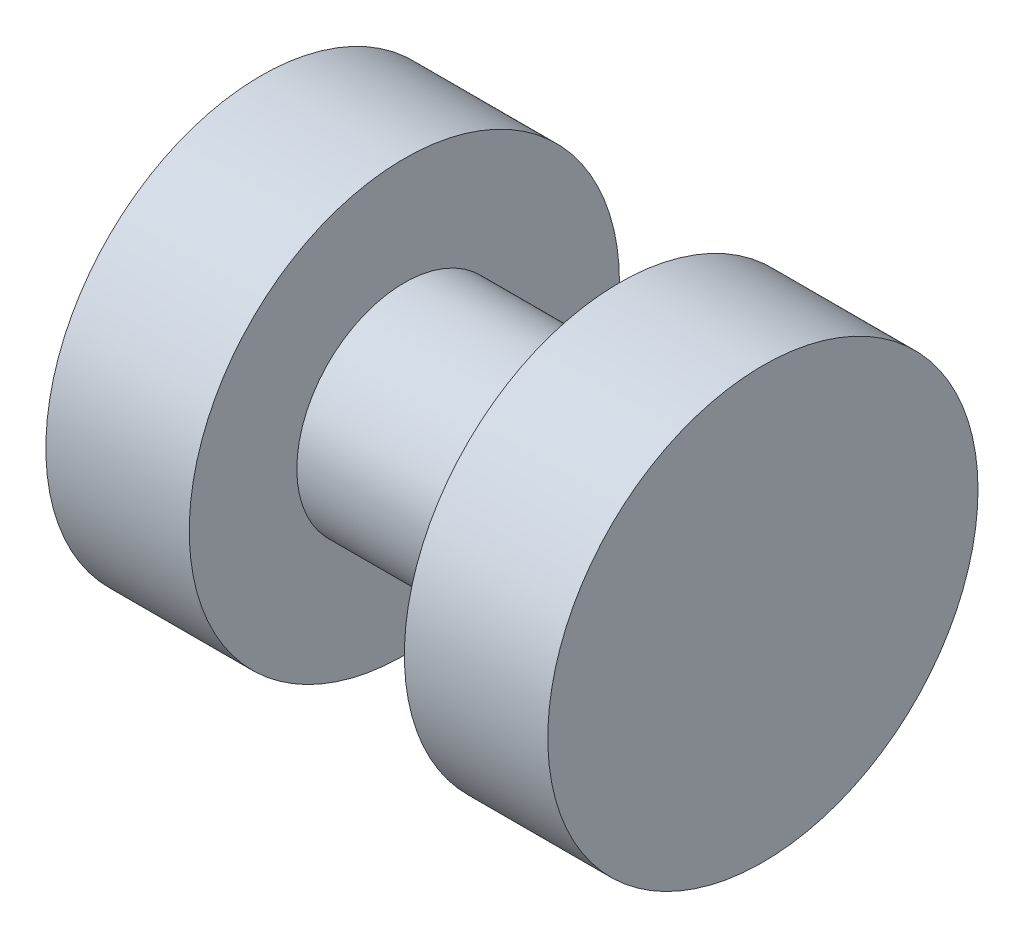
ISO-10303-21;
HEADER;
FILE_DESCRIPTION(('STEP AP214'),'2;1');
FILE_NAME('part.step','',(''),(''),'','','');
FILE_SCHEMA(('AUTOMOTIVE_DESIGN { 1 0 10303 214 1 1 1 1 }'));
ENDSEC;
DATA;
#1=APPLICATION_CONTEXT('core data for automotive mechanical design processes');
#2=APPLICATION_PROTOCOL_DEFINITION('international standard','automotive_design',2000,#1);
#3=PRODUCT_CONTEXT('',#1,'mechanical');
#4=PRODUCT('Part','Part','',(#3));
#5=PRODUCT_RELATED_PRODUCT_CATEGORY('part','',(#4));
#6=PRODUCT_DEFINITION_FORMATION('','',#4);
#7=PRODUCT_DEFINITION_CONTEXT('part definition',#1,'design');
#8=PRODUCT_DEFINITION('design','',#6,#7);
#9=PRODUCT_DEFINITION_SHAPE('','',#8);
#10=(LENGTH_UNIT() NAMED_UNIT(*) SI_UNIT(.MILLI.,.METRE.));
#11=(NAMED_UNIT(*) PLANE_ANGLE_UNIT() SI_UNIT($,.RADIAN.));
#12=(NAMED_UNIT(*) SI_UNIT($,.STERADIAN.) SOLID_ANGLE_UNIT());
#13=UNCERTAINTY_MEASURE_WITH_UNIT(LENGTH_MEASURE(1.E-05),#10,'distance_accuracy_value','');
#14=(GEOMETRIC_REPRESENTATION_CONTEXT(3) GLOBAL_UNCERTAINTY_ASSIGNED_CONTEXT((#13)) GLOBAL_UNIT_ASSIGNED_CONTEXT((#10,
#11,#12)) REPRESENTATION_CONTEXT('',''));
#15=CARTESIAN_POINT('',(0.,0.,0.));
#16=DIRECTION('',(0.,0.,1.));
#17=DIRECTION('',(1.,0.,0.));
#18=AXIS2_PLACEMENT_3D('',#15,#16,#17);
#19=CARTESIAN_POINT('',(2.,0.,0.));
#20=DIRECTION('',(-1.,0.,0.));
#21=DIRECTION('',(0.,0.,1.));
#22=AXIS2_PLACEMENT_3D('',#19,#20,#21);
#23=CYLINDRICAL_SURFACE('',#22,3.);
#24=CARTESIAN_POINT('',(2.,0.,0.));
#25=DIRECTION('',(1.,0.,0.));
#26=DIRECTION('',(0.,0.,-1.));
#27=AXIS2_PLACEMENT_3D('',#24,#25,#26);
#28=CIRCLE('',#27,3.);
#29=CARTESIAN_POINT('',(2.,0.,-3.));
#30=VERTEX_POINT('',#29);
#31=EDGE_CURVE('E37',#30,#30,#28,.T.);
#32=ORIENTED_EDGE('',*,*,#31,.F.);
#33=EDGE_LOOP('',(#32));
#34=FACE_BOUND('',#33,.T.);
#35=CARTESIAN_POINT('',(0.,0.,0.));
#36=DIRECTION('',(1.,0.,0.));
#37=DIRECTION('',(0.,0.,-1.));
#38=AXIS2_PLACEMENT_3D('',#35,#36,#37);
#39=CIRCLE('',#38,3.);
#40=CARTESIAN_POINT('',(0.,0.,-3.));
#41=VERTEX_POINT('',#40);
#42=EDGE_CURVE('E33',#41,#41,#39,.T.);
#43=ORIENTED_EDGE('',*,*,#42,.T.);
#44=EDGE_LOOP('',(#43));
#45=FACE_BOUND('',#44,.T.);
#46=ADVANCED_FACE('F30',(#34,#45),#23,.T.);
#47=CARTESIAN_POINT('',(2.,0.,0.));
#48=DIRECTION('',(1.,0.,0.));
#49=DIRECTION('',(0.,0.,-1.));
#50=AXIS2_PLACEMENT_3D('',#47,#48,#49);
#51=PLANE('',#50);
#52=CARTESIAN_POINT('',(2.,0.,0.));
#53=DIRECTION('',(1.,0.,0.));
#54=DIRECTION('',(0.,0.,-1.));
#55=AXIS2_PLACEMENT_3D('',#52,#53,#54);
#56=CIRCLE('',#55,1.5);
#57=CARTESIAN_POINT('',(2.,0.,-1.5));
#58=VERTEX_POINT('',#57);
#59=EDGE_CURVE('E10',#58,#58,#56,.T.);
#60=ORIENTED_EDGE('',*,*,#59,.F.);
#61=EDGE_LOOP('',(#60));
#62=FACE_BOUND('',#61,.T.);
#63=ORIENTED_EDGE('',*,*,#31,.T.);
#64=EDGE_LOOP('',(#63));
#65=FACE_BOUND('',#64,.T.);
#66=ADVANCED_FACE('F71',(#62,#65),#51,.T.);
#67=CARTESIAN_POINT('',(0.,0.,0.));
#68=DIRECTION('',(1.,0.,0.));
#69=DIRECTION('',(0.,0.,-1.));
#70=AXIS2_PLACEMENT_3D('',#67,#68,#69);
#71=PLANE('',#70);
#72=ORIENTED_EDGE('',*,*,#42,.F.);
#73=EDGE_LOOP('',(#72));
#74=FACE_BOUND('',#73,.T.);
#75=ADVANCED_FACE('F76',(#74),#71,.F.);
#76=CARTESIAN_POINT('',(5.,0.,0.));
#77=DIRECTION('',(-1.,0.,0.));
#78=DIRECTION('',(0.,0.,1.));
#79=AXIS2_PLACEMENT_3D('',#76,#77,#78);
#80=CYLINDRICAL_SURFACE('',#79,1.5);
#81=CARTESIAN_POINT('',(5.,0.,0.));
#82=DIRECTION('',(1.,0.,0.));
#83=DIRECTION('',(0.,0.,-1.));
#84=AXIS2_PLACEMENT_3D('',#81,#82,#83);
#85=CIRCLE('',#84,1.5);
#86=CARTESIAN_POINT('',(5.,0.,-1.5));
#87=VERTEX_POINT('',#86);
#88=EDGE_CURVE('E43',#87,#87,#85,.T.);
#89=ORIENTED_EDGE('',*,*,#88,.F.);
#90=EDGE_LOOP('',(#89));
#91=FACE_BOUND('',#90,.T.);
#92=ORIENTED_EDGE('',*,*,#59,.T.);
#93=EDGE_LOOP('',(#92));
#94=FACE_BOUND('',#93,.T.);
#95=ADVANCED_FACE('F58',(#91,#94),#80,.T.);
#96=CARTESIAN_POINT('',(7.,0.,0.));
#97=DIRECTION('',(-1.,0.,0.));
#98=DIRECTION('',(0.,0.,1.));
#99=AXIS2_PLACEMENT_3D('',#96,#97,#98);
#100=CYLINDRICAL_SURFACE('',#99,3.);
#101=CARTESIAN_POINT('',(7.,0.,0.));
#102=DIRECTION('',(1.,0.,0.));
#103=DIRECTION('',(0.,0.,-1.));
#104=AXIS2_PLACEMENT_3D('',#101,#102,#103);
#105=CIRCLE('',#104,3.);
#106=CARTESIAN_POINT('',(7.,0.,-3.));
#107=VERTEX_POINT('',#106);
#108=EDGE_CURVE('E46',#107,#107,#105,.T.);
#109=ORIENTED_EDGE('',*,*,#108,.F.);
#110=EDGE_LOOP('',(#109));
#111=FACE_BOUND('',#110,.T.);
#112=CARTESIAN_POINT('',(5.,0.,0.));
#113=DIRECTION('',(1.,0.,0.));
#114=DIRECTION('',(0.,0.,-1.));
#115=AXIS2_PLACEMENT_3D('',#112,#113,#114);
#116=CIRCLE('',#115,3.);
#117=CARTESIAN_POINT('',(5.,0.,-3.));
#118=VERTEX_POINT('',#117);
#119=EDGE_CURVE('E47',#118,#118,#116,.T.);
#120=ORIENTED_EDGE('',*,*,#119,.T.);
#121=EDGE_LOOP('',(#120));
#122=FACE_BOUND('',#121,.T.);
#123=ADVANCED_FACE('F55',(#111,#122),#100,.T.);
#124=CARTESIAN_POINT('',(7.,0.,0.));
#125=DIRECTION('',(1.,0.,0.));
#126=DIRECTION('',(0.,0.,-1.));
#127=AXIS2_PLACEMENT_3D('',#124,#125,#126);
#128=PLANE('',#127);
#129=ORIENTED_EDGE('',*,*,#108,.T.);
#130=EDGE_LOOP('',(#129));
#131=FACE_BOUND('',#130,.T.);
#132=ADVANCED_FACE('F53',(#131),#128,.T.);
#133=CARTESIAN_POINT('',(5.,0.,0.));
#134=DIRECTION('',(1.,0.,0.));
#135=DIRECTION('',(0.,0.,-1.));
#136=AXIS2_PLACEMENT_3D('',#133,#134,#135);
#137=PLANE('',#136);
#138=ORIENTED_EDGE('',*,*,#88,.T.);
#139=EDGE_LOOP('',(#138));
#140=FACE_BOUND('',#139,.T.);
#141=ORIENTED_EDGE('',*,*,#119,.F.);
#142=EDGE_LOOP('',(#141));
#143=FACE_BOUND('',#142,.T.);
#144=ADVANCED_FACE('F62',(#140,#143),#137,.F.);
#145=CLOSED_SHELL('',(#46,#66,#75,#95,#123,#132,#144));
#146=MANIFOLD_SOLID_BREP('B2',#145);
#147=ADVANCED_BREP_SHAPE_REPRESENTATION('',(#18,#146),#14);
#148=SHAPE_DEFINITION_REPRESENTATION(#9,#147);
ENDSEC;
END-ISO-10303-21;
